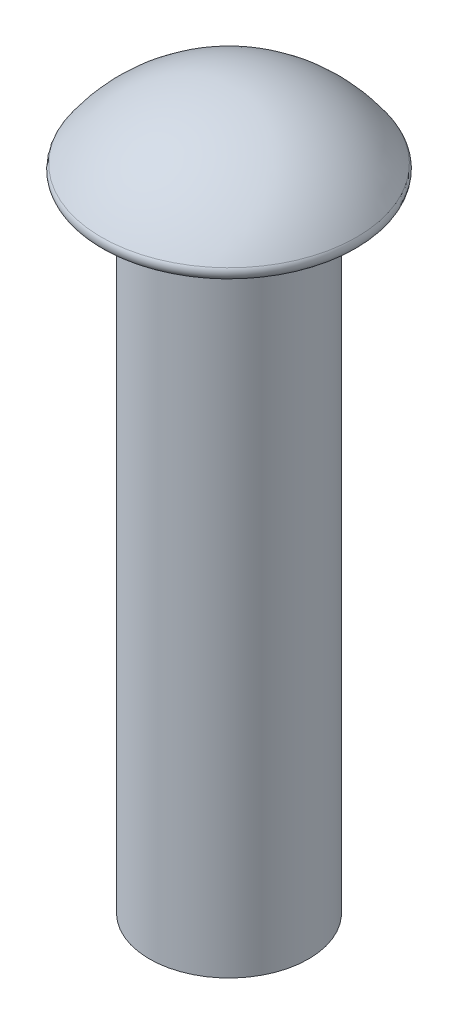
ISO-10303-21;
HEADER;
FILE_DESCRIPTION(('STEP AP214'),'2;1');
FILE_NAME('part.step','',(''),(''),'','','');
FILE_SCHEMA(('AUTOMOTIVE_DESIGN { 1 0 10303 214 1 1 1 1 }'));
ENDSEC;
DATA;
#1=APPLICATION_CONTEXT('core data for automotive mechanical design processes');
#2=APPLICATION_PROTOCOL_DEFINITION('international standard','automotive_design',2000,#1);
#3=PRODUCT_CONTEXT('',#1,'mechanical');
#4=PRODUCT('Part','Part','',(#3));
#5=PRODUCT_RELATED_PRODUCT_CATEGORY('part','',(#4));
#6=PRODUCT_DEFINITION_FORMATION('','',#4);
#7=PRODUCT_DEFINITION_CONTEXT('part definition',#1,'design');
#8=PRODUCT_DEFINITION('design','',#6,#7);
#9=PRODUCT_DEFINITION_SHAPE('','',#8);
#10=(LENGTH_UNIT() NAMED_UNIT(*) SI_UNIT(.MILLI.,.METRE.));
#11=(NAMED_UNIT(*) PLANE_ANGLE_UNIT() SI_UNIT($,.RADIAN.));
#12=(NAMED_UNIT(*) SI_UNIT($,.STERADIAN.) SOLID_ANGLE_UNIT());
#13=UNCERTAINTY_MEASURE_WITH_UNIT(LENGTH_MEASURE(1.E-05),#10,'distance_accuracy_value','');
#14=(GEOMETRIC_REPRESENTATION_CONTEXT(3) GLOBAL_UNCERTAINTY_ASSIGNED_CONTEXT((#13)) GLOBAL_UNIT_ASSIGNED_CONTEXT((#10,
#11,#12)) REPRESENTATION_CONTEXT('',''));
#15=CARTESIAN_POINT('',(0.,0.,0.));
#16=DIRECTION('',(0.,0.,1.));
#17=DIRECTION('',(1.,0.,0.));
#18=AXIS2_PLACEMENT_3D('',#15,#16,#17);
#19=CARTESIAN_POINT('',(0.,-4.5,0.));
#20=DIRECTION('',(0.,-1.,0.));
#21=DIRECTION('',(1.,0.,0.));
#22=AXIS2_PLACEMENT_3D('',#19,#20,#21);
#23=PLANE('',#22);
#24=CARTESIAN_POINT('',(0.,-4.5,0.));
#25=DIRECTION('',(0.,-1.,0.));
#26=DIRECTION('',(1.,0.,0.));
#27=AXIS2_PLACEMENT_3D('',#24,#25,#26);
#28=CIRCLE('',#27,1.);
#29=CARTESIAN_POINT('',(1.,-4.5,0.));
#30=VERTEX_POINT('',#29);
#31=EDGE_CURVE('E43',#30,#30,#28,.T.);
#32=ORIENTED_EDGE('',*,*,#31,.T.);
#33=EDGE_LOOP('',(#32));
#34=FACE_BOUND('',#33,.T.);
#35=ADVANCED_FACE('F32',(#34),#23,.T.);
#36=CARTESIAN_POINT('',(0.,-4.5,0.));
#37=DIRECTION('',(0.,-1.,0.));
#38=DIRECTION('',(1.,0.,0.));
#39=AXIS2_PLACEMENT_3D('',#36,#37,#38);
#40=CYLINDRICAL_SURFACE('',#39,1.);
#41=CARTESIAN_POINT('',(0.,3.5,0.));
#42=DIRECTION('',(0.,-1.,0.));
#43=DIRECTION('',(1.,0.,0.));
#44=AXIS2_PLACEMENT_3D('',#41,#42,#43);
#45=CIRCLE('',#44,1.);
#46=CARTESIAN_POINT('',(1.,3.5,0.));
#47=VERTEX_POINT('',#46);
#48=EDGE_CURVE('E47',#47,#47,#45,.T.);
#49=ORIENTED_EDGE('',*,*,#48,.T.);
#50=EDGE_LOOP('',(#49));
#51=FACE_BOUND('',#50,.T.);
#52=ORIENTED_EDGE('',*,*,#31,.F.);
#53=EDGE_LOOP('',(#52));
#54=FACE_BOUND('',#53,.T.);
#55=ADVANCED_FACE('F53',(#51,#54),#40,.T.);
#56=CARTESIAN_POINT('',(1.,3.5,0.));
#57=DIRECTION('',(0.,-1.,0.));
#58=DIRECTION('',(1.,0.,0.));
#59=AXIS2_PLACEMENT_3D('',#56,#57,#58);
#60=PLANE('',#59);
#61=CARTESIAN_POINT('',(0.,3.5,0.));
#62=DIRECTION('',(0.,-1.,0.));
#63=DIRECTION('',(1.,0.,0.));
#64=AXIS2_PLACEMENT_3D('',#61,#62,#63);
#65=CIRCLE('',#64,1.52052622469986);
#66=CARTESIAN_POINT('',(1.52052622469986,3.5,0.));
#67=VERTEX_POINT('',#66);
#68=EDGE_CURVE('E39',#67,#67,#65,.T.);
#69=ORIENTED_EDGE('',*,*,#68,.T.);
#70=EDGE_LOOP('',(#69));
#71=FACE_BOUND('',#70,.T.);
#72=ORIENTED_EDGE('',*,*,#48,.F.);
#73=EDGE_LOOP('',(#72));
#74=FACE_BOUND('',#73,.T.);
#75=ADVANCED_FACE('F56',(#71,#74),#60,.T.);
#76=CARTESIAN_POINT('',(0.,2.555,0.));
#77=DIRECTION('',(0.,-1.,0.));
#78=DIRECTION('',(1.,0.,0.));
#79=AXIS2_PLACEMENT_3D('',#76,#77,#78);
#80=SPHERICAL_SURFACE('',#79,1.945);
#81=CARTESIAN_POINT('',(0.,3.65663956639566,0.));
#82=DIRECTION('',(0.,-1.,0.));
#83=DIRECTION('',(1.,0.,0.));
#84=AXIS2_PLACEMENT_3D('',#81,#82,#83);
#85=CIRCLE('',#84,1.60293957021204);
#86=CARTESIAN_POINT('',(1.60293957021204,3.65663956639566,0.));
#87=VERTEX_POINT('',#86);
#88=EDGE_CURVE('E10',#87,#87,#85,.F.);
#89=ORIENTED_EDGE('',*,*,#88,.T.);
#90=EDGE_LOOP('',(#89));
#91=FACE_BOUND('',#90,.T.);
#92=ADVANCED_FACE('F58',(#91),#80,.T.);
#93=CARTESIAN_POINT('',(0.,3.6,0.));
#94=DIRECTION('',(0.,-1.,0.));
#95=DIRECTION('',(1.,0.,0.));
#96=AXIS2_PLACEMENT_3D('',#93,#94,#95);
#97=TOROIDAL_SURFACE('',#96,1.52052622469986,0.1);
#98=ORIENTED_EDGE('',*,*,#88,.F.);
#99=EDGE_LOOP('',(#98));
#100=FACE_BOUND('',#99,.T.);
#101=ORIENTED_EDGE('',*,*,#68,.F.);
#102=EDGE_LOOP('',(#101));
#103=FACE_BOUND('',#102,.T.);
#104=ADVANCED_FACE('F34',(#100,#103),#97,.T.);
#105=CLOSED_SHELL('',(#35,#55,#75,#92,#104));
#106=MANIFOLD_SOLID_BREP('B2',#105);
#107=ADVANCED_BREP_SHAPE_REPRESENTATION('',(#18,#106),#14);
#108=SHAPE_DEFINITION_REPRESENTATION(#9,#107);
ENDSEC;
END-ISO-10303-21;
